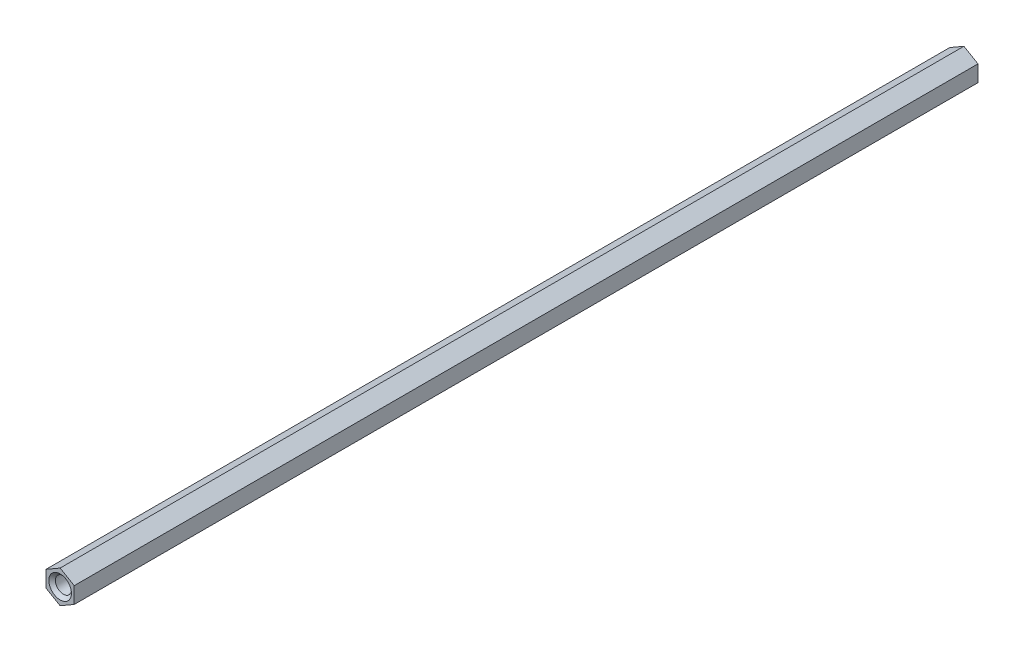
ISO-10303-21;
HEADER;
FILE_DESCRIPTION(('STEP AP214'),'2;1');
FILE_NAME('part.step','',(''),(''),'','','');
FILE_SCHEMA(('AUTOMOTIVE_DESIGN { 1 0 10303 214 1 1 1 1 }'));
ENDSEC;
DATA;
#1=APPLICATION_CONTEXT('core data for automotive mechanical design processes');
#2=APPLICATION_PROTOCOL_DEFINITION('international standard','automotive_design',2000,#1);
#3=PRODUCT_CONTEXT('',#1,'mechanical');
#4=PRODUCT('Part','Part','',(#3));
#5=PRODUCT_RELATED_PRODUCT_CATEGORY('part','',(#4));
#6=PRODUCT_DEFINITION_FORMATION('','',#4);
#7=PRODUCT_DEFINITION_CONTEXT('part definition',#1,'design');
#8=PRODUCT_DEFINITION('design','',#6,#7);
#9=PRODUCT_DEFINITION_SHAPE('','',#8);
#10=(LENGTH_UNIT() NAMED_UNIT(*) SI_UNIT(.MILLI.,.METRE.));
#11=(NAMED_UNIT(*) PLANE_ANGLE_UNIT() SI_UNIT($,.RADIAN.));
#12=(NAMED_UNIT(*) SI_UNIT($,.STERADIAN.) SOLID_ANGLE_UNIT());
#13=UNCERTAINTY_MEASURE_WITH_UNIT(LENGTH_MEASURE(1.E-05),#10,'distance_accuracy_value','');
#14=(GEOMETRIC_REPRESENTATION_CONTEXT(3) GLOBAL_UNCERTAINTY_ASSIGNED_CONTEXT((#13)) GLOBAL_UNIT_ASSIGNED_CONTEXT((#10,
#11,#12)) REPRESENTATION_CONTEXT('',''));
#15=CARTESIAN_POINT('',(0.,0.,0.));
#16=DIRECTION('',(0.,0.,1.));
#17=DIRECTION('',(1.,0.,0.));
#18=AXIS2_PLACEMENT_3D('',#15,#16,#17);
#19=CARTESIAN_POINT('',(-4.7625,2.74963065701559,152.4));
#20=DIRECTION('',(0.5,-0.866025403784439,0.));
#21=DIRECTION('',(0.866025403784439,0.5,0.));
#22=AXIS2_PLACEMENT_3D('',#19,#20,#21);
#23=PLANE('',#22);
#24=DIRECTION('',(-0.866025403784439,-0.5,0.));
#25=VECTOR('',#24,1.);
#26=CARTESIAN_POINT('',(-4.7625,2.74963065701559,-152.4));
#27=LINE('',#26,#25);
#28=CARTESIAN_POINT('',(0.,5.49926131403118,-152.4));
#29=VERTEX_POINT('',#28);
#30=CARTESIAN_POINT('',(-4.7625,2.74963065701559,-152.4));
#31=VERTEX_POINT('',#30);
#32=EDGE_CURVE('E145',#29,#31,#27,.T.);
#33=ORIENTED_EDGE('',*,*,#32,.T.);
#34=DIRECTION('',(0.,0.,-1.));
#35=VECTOR('',#34,1.);
#36=CARTESIAN_POINT('',(-4.7625,2.74963065701559,152.4));
#37=LINE('',#36,#35);
#38=CARTESIAN_POINT('',(-4.7625,2.74963065701559,152.4));
#39=VERTEX_POINT('',#38);
#40=EDGE_CURVE('E11',#39,#31,#37,.T.);
#41=ORIENTED_EDGE('',*,*,#40,.F.);
#42=DIRECTION('',(-0.866025403784439,-0.5,0.));
#43=VECTOR('',#42,1.);
#44=CARTESIAN_POINT('',(-4.7625,2.74963065701559,152.4));
#45=LINE('',#44,#43);
#46=CARTESIAN_POINT('',(0.,5.49926131403118,152.4));
#47=VERTEX_POINT('',#46);
#48=EDGE_CURVE('E162',#47,#39,#45,.T.);
#49=ORIENTED_EDGE('',*,*,#48,.F.);
#50=DIRECTION('',(0.,0.,-1.));
#51=VECTOR('',#50,1.);
#52=CARTESIAN_POINT('',(0.,5.49926131403118,152.4));
#53=LINE('',#52,#51);
#54=EDGE_CURVE('E141',#47,#29,#53,.T.);
#55=ORIENTED_EDGE('',*,*,#54,.T.);
#56=EDGE_LOOP('',(#33,#41,#49,#55));
#57=FACE_BOUND('',#56,.T.);
#58=ADVANCED_FACE('F53',(#57),#23,.F.);
#59=CARTESIAN_POINT('',(-4.7625,-2.74963065701559,152.4));
#60=DIRECTION('',(1.,0.,0.));
#61=DIRECTION('',(0.,1.,0.));
#62=AXIS2_PLACEMENT_3D('',#59,#60,#61);
#63=PLANE('',#62);
#64=DIRECTION('',(0.,-1.,0.));
#65=VECTOR('',#64,1.);
#66=CARTESIAN_POINT('',(-4.7625,-2.74963065701559,-152.4));
#67=LINE('',#66,#65);
#68=CARTESIAN_POINT('',(-4.7625,-2.74963065701559,-152.4));
#69=VERTEX_POINT('',#68);
#70=EDGE_CURVE('E149',#31,#69,#67,.T.);
#71=ORIENTED_EDGE('',*,*,#70,.T.);
#72=DIRECTION('',(0.,0.,-1.));
#73=VECTOR('',#72,1.);
#74=CARTESIAN_POINT('',(-4.7625,-2.74963065701559,152.4));
#75=LINE('',#74,#73);
#76=CARTESIAN_POINT('',(-4.7625,-2.74963065701559,152.4));
#77=VERTEX_POINT('',#76);
#78=EDGE_CURVE('E62',#77,#69,#75,.T.);
#79=ORIENTED_EDGE('',*,*,#78,.F.);
#80=DIRECTION('',(0.,-1.,0.));
#81=VECTOR('',#80,1.);
#82=CARTESIAN_POINT('',(-4.7625,-2.74963065701559,152.4));
#83=LINE('',#82,#81);
#84=EDGE_CURVE('E108',#39,#77,#83,.T.);
#85=ORIENTED_EDGE('',*,*,#84,.F.);
#86=ORIENTED_EDGE('',*,*,#40,.T.);
#87=EDGE_LOOP('',(#71,#79,#85,#86));
#88=FACE_BOUND('',#87,.T.);
#89=ADVANCED_FACE('F191',(#88),#63,.F.);
#90=CARTESIAN_POINT('',(0.,-5.49926131403118,152.4));
#91=DIRECTION('',(0.5,0.866025403784439,0.));
#92=DIRECTION('',(-0.866025403784439,0.5,0.));
#93=AXIS2_PLACEMENT_3D('',#90,#91,#92);
#94=PLANE('',#93);
#95=DIRECTION('',(0.866025403784439,-0.5,0.));
#96=VECTOR('',#95,1.);
#97=CARTESIAN_POINT('',(0.,-5.49926131403118,-152.4));
#98=LINE('',#97,#96);
#99=CARTESIAN_POINT('',(0.,-5.49926131403118,-152.4));
#100=VERTEX_POINT('',#99);
#101=EDGE_CURVE('E153',#69,#100,#98,.T.);
#102=ORIENTED_EDGE('',*,*,#101,.T.);
#103=DIRECTION('',(0.,0.,-1.));
#104=VECTOR('',#103,1.);
#105=CARTESIAN_POINT('',(0.,-5.49926131403118,152.4));
#106=LINE('',#105,#104);
#107=CARTESIAN_POINT('',(0.,-5.49926131403118,152.4));
#108=VERTEX_POINT('',#107);
#109=EDGE_CURVE('E134',#108,#100,#106,.T.);
#110=ORIENTED_EDGE('',*,*,#109,.F.);
#111=DIRECTION('',(0.866025403784439,-0.5,0.));
#112=VECTOR('',#111,1.);
#113=CARTESIAN_POINT('',(0.,-5.49926131403118,152.4));
#114=LINE('',#113,#112);
#115=EDGE_CURVE('E123',#77,#108,#114,.T.);
#116=ORIENTED_EDGE('',*,*,#115,.F.);
#117=ORIENTED_EDGE('',*,*,#78,.T.);
#118=EDGE_LOOP('',(#102,#110,#116,#117));
#119=FACE_BOUND('',#118,.T.);
#120=ADVANCED_FACE('F172',(#119),#94,.F.);
#121=CARTESIAN_POINT('',(4.7625,-2.7496306570156,152.4));
#122=DIRECTION('',(-0.5,0.866025403784439,0.));
#123=DIRECTION('',(-0.866025403784439,-0.5,0.));
#124=AXIS2_PLACEMENT_3D('',#121,#122,#123);
#125=PLANE('',#124);
#126=DIRECTION('',(0.866025403784439,0.5,0.));
#127=VECTOR('',#126,1.);
#128=CARTESIAN_POINT('',(4.7625,-2.7496306570156,-152.4));
#129=LINE('',#128,#127);
#130=CARTESIAN_POINT('',(4.7625,-2.7496306570156,-152.4));
#131=VERTEX_POINT('',#130);
#132=EDGE_CURVE('E132',#100,#131,#129,.T.);
#133=ORIENTED_EDGE('',*,*,#132,.T.);
#134=DIRECTION('',(0.,0.,-1.));
#135=VECTOR('',#134,1.);
#136=CARTESIAN_POINT('',(4.7625,-2.7496306570156,152.4));
#137=LINE('',#136,#135);
#138=CARTESIAN_POINT('',(4.7625,-2.7496306570156,152.4));
#139=VERTEX_POINT('',#138);
#140=EDGE_CURVE('E129',#139,#131,#137,.T.);
#141=ORIENTED_EDGE('',*,*,#140,.F.);
#142=DIRECTION('',(0.866025403784439,0.5,0.));
#143=VECTOR('',#142,1.);
#144=CARTESIAN_POINT('',(4.7625,-2.7496306570156,152.4));
#145=LINE('',#144,#143);
#146=EDGE_CURVE('E117',#108,#139,#145,.T.);
#147=ORIENTED_EDGE('',*,*,#146,.F.);
#148=ORIENTED_EDGE('',*,*,#109,.T.);
#149=EDGE_LOOP('',(#133,#141,#147,#148));
#150=FACE_BOUND('',#149,.T.);
#151=ADVANCED_FACE('F130',(#150),#125,.F.);
#152=CARTESIAN_POINT('',(4.7625,2.74963065701559,152.4));
#153=DIRECTION('',(-1.,0.,0.));
#154=DIRECTION('',(0.,0.,1.));
#155=AXIS2_PLACEMENT_3D('',#152,#153,#154);
#156=PLANE('',#155);
#157=DIRECTION('',(0.,1.,0.));
#158=VECTOR('',#157,1.);
#159=CARTESIAN_POINT('',(4.7625,2.74963065701559,-152.4));
#160=LINE('',#159,#158);
#161=CARTESIAN_POINT('',(4.7625,2.74963065701559,-152.4));
#162=VERTEX_POINT('',#161);
#163=EDGE_CURVE('E94',#131,#162,#160,.T.);
#164=ORIENTED_EDGE('',*,*,#163,.T.);
#165=DIRECTION('',(0.,0.,-1.));
#166=VECTOR('',#165,1.);
#167=CARTESIAN_POINT('',(4.7625,2.74963065701559,152.4));
#168=LINE('',#167,#166);
#169=CARTESIAN_POINT('',(4.7625,2.74963065701559,152.4));
#170=VERTEX_POINT('',#169);
#171=EDGE_CURVE('E135',#170,#162,#168,.T.);
#172=ORIENTED_EDGE('',*,*,#171,.F.);
#173=DIRECTION('',(0.,1.,0.));
#174=VECTOR('',#173,1.);
#175=CARTESIAN_POINT('',(4.7625,2.74963065701559,152.4));
#176=LINE('',#175,#174);
#177=EDGE_CURVE('E121',#139,#170,#176,.T.);
#178=ORIENTED_EDGE('',*,*,#177,.F.);
#179=ORIENTED_EDGE('',*,*,#140,.T.);
#180=EDGE_LOOP('',(#164,#172,#178,#179));
#181=FACE_BOUND('',#180,.T.);
#182=ADVANCED_FACE('F137',(#181),#156,.F.);
#183=CARTESIAN_POINT('',(0.,5.49926131403118,152.4));
#184=DIRECTION('',(-0.5,-0.866025403784439,0.));
#185=DIRECTION('',(0.866025403784439,-0.5,0.));
#186=AXIS2_PLACEMENT_3D('',#183,#184,#185);
#187=PLANE('',#186);
#188=DIRECTION('',(-0.866025403784439,0.5,0.));
#189=VECTOR('',#188,1.);
#190=CARTESIAN_POINT('',(0.,5.49926131403118,-152.4));
#191=LINE('',#190,#189);
#192=EDGE_CURVE('E100',#162,#29,#191,.T.);
#193=ORIENTED_EDGE('',*,*,#192,.T.);
#194=ORIENTED_EDGE('',*,*,#54,.F.);
#195=DIRECTION('',(-0.866025403784439,0.5,0.));
#196=VECTOR('',#195,1.);
#197=CARTESIAN_POINT('',(0.,5.49926131403118,152.4));
#198=LINE('',#197,#196);
#199=EDGE_CURVE('E70',#170,#47,#198,.T.);
#200=ORIENTED_EDGE('',*,*,#199,.F.);
#201=ORIENTED_EDGE('',*,*,#171,.T.);
#202=EDGE_LOOP('',(#193,#194,#200,#201));
#203=FACE_BOUND('',#202,.T.);
#204=ADVANCED_FACE('F179',(#203),#187,.F.);
#205=CARTESIAN_POINT('',(0.,0.,152.4));
#206=DIRECTION('',(0.,0.,-1.));
#207=DIRECTION('',(-1.,0.,0.));
#208=AXIS2_PLACEMENT_3D('',#205,#206,#207);
#209=PLANE('',#208);
#210=CARTESIAN_POINT('',(0.,0.,152.4));
#211=DIRECTION('',(0.,0.,1.));
#212=DIRECTION('',(1.,0.,0.));
#213=AXIS2_PLACEMENT_3D('',#210,#211,#212);
#214=CIRCLE('',#213,3.81);
#215=CARTESIAN_POINT('',(3.81,0.,152.4));
#216=VERTEX_POINT('',#215);
#217=EDGE_CURVE('E312',#216,#216,#214,.T.);
#218=ORIENTED_EDGE('',*,*,#217,.F.);
#219=EDGE_LOOP('',(#218));
#220=FACE_BOUND('',#219,.T.);
#221=ORIENTED_EDGE('',*,*,#48,.T.);
#222=ORIENTED_EDGE('',*,*,#84,.T.);
#223=ORIENTED_EDGE('',*,*,#115,.T.);
#224=ORIENTED_EDGE('',*,*,#146,.T.);
#225=ORIENTED_EDGE('',*,*,#177,.T.);
#226=ORIENTED_EDGE('',*,*,#199,.T.);
#227=EDGE_LOOP('',(#221,#222,#223,#224,#225,#226));
#228=FACE_BOUND('',#227,.T.);
#229=ADVANCED_FACE('F119',(#220,#228),#209,.F.);
#230=CARTESIAN_POINT('',(0.,0.,-152.4));
#231=DIRECTION('',(0.,0.,-1.));
#232=DIRECTION('',(-1.,0.,0.));
#233=AXIS2_PLACEMENT_3D('',#230,#231,#232);
#234=PLANE('',#233);
#235=CARTESIAN_POINT('',(0.,0.,-152.4));
#236=DIRECTION('',(0.,0.,-1.));
#237=DIRECTION('',(-1.,0.,0.));
#238=AXIS2_PLACEMENT_3D('',#235,#236,#237);
#239=CIRCLE('',#238,3.81);
#240=CARTESIAN_POINT('',(-3.81,0.,-152.4));
#241=VERTEX_POINT('',#240);
#242=EDGE_CURVE('E302',#241,#241,#239,.T.);
#243=ORIENTED_EDGE('',*,*,#242,.F.);
#244=EDGE_LOOP('',(#243));
#245=FACE_BOUND('',#244,.T.);
#246=ORIENTED_EDGE('',*,*,#32,.F.);
#247=ORIENTED_EDGE('',*,*,#192,.F.);
#248=ORIENTED_EDGE('',*,*,#163,.F.);
#249=ORIENTED_EDGE('',*,*,#132,.F.);
#250=ORIENTED_EDGE('',*,*,#101,.F.);
#251=ORIENTED_EDGE('',*,*,#70,.F.);
#252=EDGE_LOOP('',(#246,#247,#248,#249,#250,#251));
#253=FACE_BOUND('',#252,.T.);
#254=ADVANCED_FACE('F175',(#245,#253),#234,.T.);
#255=CARTESIAN_POINT('',(0.,0.,137.16));
#256=DIRECTION('',(0.,0.,1.));
#257=DIRECTION('',(1.,0.,0.));
#258=AXIS2_PLACEMENT_3D('',#255,#256,#257);
#259=CONICAL_SURFACE('',#258,2.7051,1.02974425867666);
#260=CARTESIAN_POINT('',(0.,0.,135.534611939469));
#261=VERTEX_POINT('',#260);
#262=VERTEX_LOOP('',#261);
#263=FACE_BOUND('',#262,.T.);
#264=CARTESIAN_POINT('',(0.,0.,137.16));
#265=DIRECTION('',(0.,0.,1.));
#266=DIRECTION('',(1.,0.,0.));
#267=AXIS2_PLACEMENT_3D('',#264,#265,#266);
#268=CIRCLE('',#267,2.7051);
#269=CARTESIAN_POINT('',(2.7051,0.,137.16));
#270=VERTEX_POINT('',#269);
#271=EDGE_CURVE('E150',#270,#270,#268,.T.);
#272=ORIENTED_EDGE('',*,*,#271,.T.);
#273=EDGE_LOOP('',(#272));
#274=FACE_BOUND('',#273,.T.);
#275=ADVANCED_FACE('F231',(#263,#274),#259,.F.);
#276=CARTESIAN_POINT('',(0.,0.,152.4));
#277=DIRECTION('',(0.,0.,1.));
#278=DIRECTION('',(1.,0.,0.));
#279=AXIS2_PLACEMENT_3D('',#276,#277,#278);
#280=CYLINDRICAL_SURFACE('',#279,2.7051);
#281=ORIENTED_EDGE('',*,*,#271,.F.);
#282=EDGE_LOOP('',(#281));
#283=FACE_BOUND('',#282,.T.);
#284=CARTESIAN_POINT('',(0.,0.,151.2951));
#285=DIRECTION('',(0.,0.,1.));
#286=DIRECTION('',(1.,0.,0.));
#287=AXIS2_PLACEMENT_3D('',#284,#285,#286);
#288=CIRCLE('',#287,2.7051);
#289=CARTESIAN_POINT('',(2.7051,0.,151.2951));
#290=VERTEX_POINT('',#289);
#291=EDGE_CURVE('E316',#290,#290,#288,.T.);
#292=ORIENTED_EDGE('',*,*,#291,.T.);
#293=EDGE_LOOP('',(#292));
#294=FACE_BOUND('',#293,.T.);
#295=ADVANCED_FACE('F241',(#283,#294),#280,.F.);
#296=CARTESIAN_POINT('',(0.,0.,152.4));
#297=DIRECTION('',(0.,0.,1.));
#298=DIRECTION('',(1.,0.,0.));
#299=AXIS2_PLACEMENT_3D('',#296,#297,#298);
#300=CONICAL_SURFACE('',#299,3.81,0.785398163397453);
#301=ORIENTED_EDGE('',*,*,#291,.F.);
#302=EDGE_LOOP('',(#301));
#303=FACE_BOUND('',#302,.T.);
#304=ORIENTED_EDGE('',*,*,#217,.T.);
#305=EDGE_LOOP('',(#304));
#306=FACE_BOUND('',#305,.T.);
#307=ADVANCED_FACE('F252',(#303,#306),#300,.F.);
#308=CARTESIAN_POINT('',(0.,0.,-135.1661));
#309=DIRECTION('',(0.,0.,-1.));
#310=DIRECTION('',(-1.,0.,0.));
#311=AXIS2_PLACEMENT_3D('',#308,#309,#310);
#312=CONICAL_SURFACE('',#311,2.7051,1.02974425867665);
#313=CARTESIAN_POINT('',(0.,0.,-133.540711939469));
#314=VERTEX_POINT('',#313);
#315=VERTEX_LOOP('',#314);
#316=FACE_BOUND('',#315,.T.);
#317=CARTESIAN_POINT('',(0.,0.,-135.1661));
#318=DIRECTION('',(0.,0.,-1.));
#319=DIRECTION('',(-1.,0.,0.));
#320=AXIS2_PLACEMENT_3D('',#317,#318,#319);
#321=CIRCLE('',#320,2.7051);
#322=CARTESIAN_POINT('',(-2.7051,0.,-135.1661));
#323=VERTEX_POINT('',#322);
#324=EDGE_CURVE('E306',#323,#323,#321,.T.);
#325=ORIENTED_EDGE('',*,*,#324,.T.);
#326=EDGE_LOOP('',(#325));
#327=FACE_BOUND('',#326,.T.);
#328=ADVANCED_FACE('F262',(#316,#327),#312,.F.);
#329=CARTESIAN_POINT('',(0.,0.,-152.4));
#330=DIRECTION('',(0.,0.,-1.));
#331=DIRECTION('',(-1.,0.,0.));
#332=AXIS2_PLACEMENT_3D('',#329,#330,#331);
#333=CYLINDRICAL_SURFACE('',#332,2.7051);
#334=ORIENTED_EDGE('',*,*,#324,.F.);
#335=EDGE_LOOP('',(#334));
#336=FACE_BOUND('',#335,.T.);
#337=CARTESIAN_POINT('',(0.,0.,-151.2951));
#338=DIRECTION('',(0.,0.,-1.));
#339=DIRECTION('',(-1.,0.,0.));
#340=AXIS2_PLACEMENT_3D('',#337,#338,#339);
#341=CIRCLE('',#340,2.7051);
#342=CARTESIAN_POINT('',(-2.7051,0.,-151.2951));
#343=VERTEX_POINT('',#342);
#344=EDGE_CURVE('E299',#343,#343,#341,.T.);
#345=ORIENTED_EDGE('',*,*,#344,.T.);
#346=EDGE_LOOP('',(#345));
#347=FACE_BOUND('',#346,.T.);
#348=ADVANCED_FACE('F271',(#336,#347),#333,.F.);
#349=CARTESIAN_POINT('',(0.,0.,-152.4));
#350=DIRECTION('',(0.,0.,-1.));
#351=DIRECTION('',(-1.,0.,0.));
#352=AXIS2_PLACEMENT_3D('',#349,#350,#351);
#353=CONICAL_SURFACE('',#352,3.81,0.785398163397452);
#354=ORIENTED_EDGE('',*,*,#344,.F.);
#355=EDGE_LOOP('',(#354));
#356=FACE_BOUND('',#355,.T.);
#357=ORIENTED_EDGE('',*,*,#242,.T.);
#358=EDGE_LOOP('',(#357));
#359=FACE_BOUND('',#358,.T.);
#360=ADVANCED_FACE('F282',(#356,#359),#353,.F.);
#361=CLOSED_SHELL('',(#58,#89,#120,#151,#182,#204,#229,#254,#275,#295,#307,#328,#348,#360));
#362=MANIFOLD_SOLID_BREP('B2',#361);
#363=ADVANCED_BREP_SHAPE_REPRESENTATION('',(#18,#362),#14);
#364=SHAPE_DEFINITION_REPRESENTATION(#9,#363);
ENDSEC;
END-ISO-10303-21;
